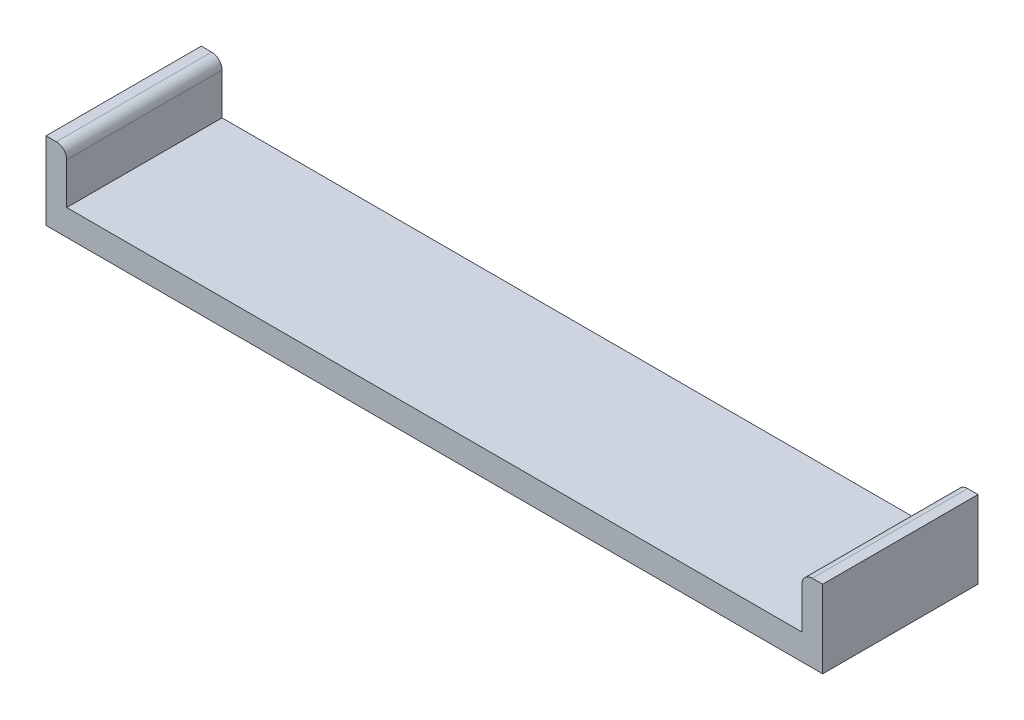
ISO-10303-21;
HEADER;
FILE_DESCRIPTION(('STEP AP214'),'2;1');
FILE_NAME('part.step','',(''),(''),'','','');
FILE_SCHEMA(('AUTOMOTIVE_DESIGN { 1 0 10303 214 1 1 1 1 }'));
ENDSEC;
DATA;
#1=APPLICATION_CONTEXT('core data for automotive mechanical design processes');
#2=APPLICATION_PROTOCOL_DEFINITION('international standard','automotive_design',2000,#1);
#3=PRODUCT_CONTEXT('',#1,'mechanical');
#4=PRODUCT('Part','Part','',(#3));
#5=PRODUCT_RELATED_PRODUCT_CATEGORY('part','',(#4));
#6=PRODUCT_DEFINITION_FORMATION('','',#4);
#7=PRODUCT_DEFINITION_CONTEXT('part definition',#1,'design');
#8=PRODUCT_DEFINITION('design','',#6,#7);
#9=PRODUCT_DEFINITION_SHAPE('','',#8);
#10=(LENGTH_UNIT() NAMED_UNIT(*) SI_UNIT(.MILLI.,.METRE.));
#11=(NAMED_UNIT(*) PLANE_ANGLE_UNIT() SI_UNIT($,.RADIAN.));
#12=(NAMED_UNIT(*) SI_UNIT($,.STERADIAN.) SOLID_ANGLE_UNIT());
#13=UNCERTAINTY_MEASURE_WITH_UNIT(LENGTH_MEASURE(1.E-05),#10,'distance_accuracy_value','');
#14=(GEOMETRIC_REPRESENTATION_CONTEXT(3) GLOBAL_UNCERTAINTY_ASSIGNED_CONTEXT((#13)) GLOBAL_UNIT_ASSIGNED_CONTEXT((#10,
#11,#12)) REPRESENTATION_CONTEXT('',''));
#15=CARTESIAN_POINT('',(0.,0.,0.));
#16=DIRECTION('',(0.,0.,1.));
#17=DIRECTION('',(1.,0.,0.));
#18=AXIS2_PLACEMENT_3D('',#15,#16,#17);
#19=CARTESIAN_POINT('',(0.,5.,0.));
#20=DIRECTION('',(0.,-1.,0.));
#21=DIRECTION('',(0.,0.,-1.));
#22=AXIS2_PLACEMENT_3D('',#19,#20,#21);
#23=PLANE('',#22);
#24=DIRECTION('',(0.,0.,-1.));
#25=VECTOR('',#24,1.);
#26=CARTESIAN_POINT('',(4.,5.,-30.));
#27=LINE('',#26,#25);
#28=CARTESIAN_POINT('',(4.,5.,0.));
#29=VERTEX_POINT('',#28);
#30=CARTESIAN_POINT('',(4.,5.,-30.));
#31=VERTEX_POINT('',#30);
#32=EDGE_CURVE('E138',#29,#31,#27,.T.);
#33=ORIENTED_EDGE('',*,*,#32,.F.);
#34=DIRECTION('',(1.,0.,0.));
#35=VECTOR('',#34,1.);
#36=CARTESIAN_POINT('',(0.,5.,0.));
#37=LINE('',#36,#35);
#38=CARTESIAN_POINT('',(146.,5.,0.));
#39=VERTEX_POINT('',#38);
#40=EDGE_CURVE('E163',#29,#39,#37,.T.);
#41=ORIENTED_EDGE('',*,*,#40,.T.);
#42=DIRECTION('',(0.,0.,1.));
#43=VECTOR('',#42,1.);
#44=CARTESIAN_POINT('',(146.,5.,-30.));
#45=LINE('',#44,#43);
#46=CARTESIAN_POINT('',(146.,5.,-30.));
#47=VERTEX_POINT('',#46);
#48=EDGE_CURVE('E148',#47,#39,#45,.T.);
#49=ORIENTED_EDGE('',*,*,#48,.F.);
#50=DIRECTION('',(-1.,0.,0.));
#51=VECTOR('',#50,1.);
#52=CARTESIAN_POINT('',(0.,5.,-30.));
#53=LINE('',#52,#51);
#54=EDGE_CURVE('E166',#47,#31,#53,.T.);
#55=ORIENTED_EDGE('',*,*,#54,.T.);
#56=EDGE_LOOP('',(#33,#41,#49,#55));
#57=FACE_BOUND('',#56,.T.);
#58=ADVANCED_FACE('F37',(#57),#23,.F.);
#59=CARTESIAN_POINT('',(0.,5.,0.));
#60=DIRECTION('',(1.,0.,0.));
#61=DIRECTION('',(0.,0.,-1.));
#62=AXIS2_PLACEMENT_3D('',#59,#60,#61);
#63=PLANE('',#62);
#64=DIRECTION('',(0.,0.,1.));
#65=VECTOR('',#64,1.);
#66=CARTESIAN_POINT('',(0.,0.,0.));
#67=LINE('',#66,#65);
#68=CARTESIAN_POINT('',(0.,0.,-30.));
#69=VERTEX_POINT('',#68);
#70=CARTESIAN_POINT('',(0.,0.,0.));
#71=VERTEX_POINT('',#70);
#72=EDGE_CURVE('E121',#69,#71,#67,.T.);
#73=ORIENTED_EDGE('',*,*,#72,.T.);
#74=DIRECTION('',(0.,-1.,0.));
#75=VECTOR('',#74,1.);
#76=CARTESIAN_POINT('',(0.,5.,0.));
#77=LINE('',#76,#75);
#78=CARTESIAN_POINT('',(0.,15.,0.));
#79=VERTEX_POINT('',#78);
#80=EDGE_CURVE('E114',#79,#71,#77,.T.);
#81=ORIENTED_EDGE('',*,*,#80,.F.);
#82=DIRECTION('',(0.,0.,1.));
#83=VECTOR('',#82,1.);
#84=CARTESIAN_POINT('',(0.,15.,-30.));
#85=LINE('',#84,#83);
#86=CARTESIAN_POINT('',(0.,15.,-30.));
#87=VERTEX_POINT('',#86);
#88=EDGE_CURVE('E119',#87,#79,#85,.T.);
#89=ORIENTED_EDGE('',*,*,#88,.F.);
#90=DIRECTION('',(0.,-1.,0.));
#91=VECTOR('',#90,1.);
#92=CARTESIAN_POINT('',(0.,5.,-30.));
#93=LINE('',#92,#91);
#94=EDGE_CURVE('E170',#87,#69,#93,.T.);
#95=ORIENTED_EDGE('',*,*,#94,.T.);
#96=EDGE_LOOP('',(#73,#81,#89,#95));
#97=FACE_BOUND('',#96,.T.);
#98=ADVANCED_FACE('F116',(#97),#63,.F.);
#99=CARTESIAN_POINT('',(0.,5.,0.));
#100=DIRECTION('',(0.,0.,-1.));
#101=DIRECTION('',(-1.,0.,0.));
#102=AXIS2_PLACEMENT_3D('',#99,#100,#101);
#103=PLANE('',#102);
#104=DIRECTION('',(1.,0.,0.));
#105=VECTOR('',#104,1.);
#106=CARTESIAN_POINT('',(150.,15.,0.));
#107=LINE('',#106,#105);
#108=CARTESIAN_POINT('',(148.,15.,0.));
#109=VERTEX_POINT('',#108);
#110=CARTESIAN_POINT('',(150.,15.,0.));
#111=VERTEX_POINT('',#110);
#112=EDGE_CURVE('E155',#109,#111,#107,.T.);
#113=ORIENTED_EDGE('',*,*,#112,.F.);
#114=CARTESIAN_POINT('',(148.,13.,0.));
#115=DIRECTION('',(0.,0.,-1.));
#116=DIRECTION('',(-1.,0.,0.));
#117=AXIS2_PLACEMENT_3D('',#114,#115,#116);
#118=CIRCLE('',#117,2.);
#119=CARTESIAN_POINT('',(146.,13.,0.));
#120=VERTEX_POINT('',#119);
#121=EDGE_CURVE('E186',#109,#120,#118,.F.);
#122=ORIENTED_EDGE('',*,*,#121,.T.);
#123=DIRECTION('',(0.,-1.,0.));
#124=VECTOR('',#123,1.);
#125=CARTESIAN_POINT('',(146.,15.,0.));
#126=LINE('',#125,#124);
#127=EDGE_CURVE('E157',#120,#39,#126,.T.);
#128=ORIENTED_EDGE('',*,*,#127,.T.);
#129=ORIENTED_EDGE('',*,*,#40,.F.);
#130=DIRECTION('',(0.,-1.,0.));
#131=VECTOR('',#130,1.);
#132=CARTESIAN_POINT('',(4.,15.,0.));
#133=LINE('',#132,#131);
#134=CARTESIAN_POINT('',(4.,13.,0.));
#135=VERTEX_POINT('',#134);
#136=EDGE_CURVE('E146',#135,#29,#133,.T.);
#137=ORIENTED_EDGE('',*,*,#136,.F.);
#138=CARTESIAN_POINT('',(2.,13.,0.));
#139=DIRECTION('',(0.,0.,-1.));
#140=DIRECTION('',(-1.,0.,0.));
#141=AXIS2_PLACEMENT_3D('',#138,#139,#140);
#142=CIRCLE('',#141,2.);
#143=CARTESIAN_POINT('',(2.,15.,0.));
#144=VERTEX_POINT('',#143);
#145=EDGE_CURVE('E132',#135,#144,#142,.F.);
#146=ORIENTED_EDGE('',*,*,#145,.T.);
#147=DIRECTION('',(1.,0.,0.));
#148=VECTOR('',#147,1.);
#149=CARTESIAN_POINT('',(0.,15.,0.));
#150=LINE('',#149,#148);
#151=EDGE_CURVE('E127',#79,#144,#150,.T.);
#152=ORIENTED_EDGE('',*,*,#151,.F.);
#153=ORIENTED_EDGE('',*,*,#80,.T.);
#154=DIRECTION('',(1.,0.,0.));
#155=VECTOR('',#154,1.);
#156=CARTESIAN_POINT('',(0.,0.,0.));
#157=LINE('',#156,#155);
#158=CARTESIAN_POINT('',(150.,0.,0.));
#159=VERTEX_POINT('',#158);
#160=EDGE_CURVE('E172',#71,#159,#157,.T.);
#161=ORIENTED_EDGE('',*,*,#160,.T.);
#162=DIRECTION('',(0.,-1.,0.));
#163=VECTOR('',#162,1.);
#164=CARTESIAN_POINT('',(150.,5.,0.));
#165=LINE('',#164,#163);
#166=EDGE_CURVE('E124',#111,#159,#165,.T.);
#167=ORIENTED_EDGE('',*,*,#166,.F.);
#168=EDGE_LOOP('',(#113,#122,#128,#129,#137,#146,#152,#153,#161,#167));
#169=FACE_BOUND('',#168,.T.);
#170=ADVANCED_FACE('F129',(#169),#103,.F.);
#171=CARTESIAN_POINT('',(150.,5.,0.));
#172=DIRECTION('',(-1.,0.,0.));
#173=DIRECTION('',(0.,0.,1.));
#174=AXIS2_PLACEMENT_3D('',#171,#172,#173);
#175=PLANE('',#174);
#176=DIRECTION('',(0.,0.,-1.));
#177=VECTOR('',#176,1.);
#178=CARTESIAN_POINT('',(150.,0.,0.));
#179=LINE('',#178,#177);
#180=CARTESIAN_POINT('',(150.,0.,-30.));
#181=VERTEX_POINT('',#180);
#182=EDGE_CURVE('E174',#159,#181,#179,.T.);
#183=ORIENTED_EDGE('',*,*,#182,.T.);
#184=DIRECTION('',(0.,-1.,0.));
#185=VECTOR('',#184,1.);
#186=CARTESIAN_POINT('',(150.,5.,-30.));
#187=LINE('',#186,#185);
#188=CARTESIAN_POINT('',(150.,15.,-30.));
#189=VERTEX_POINT('',#188);
#190=EDGE_CURVE('E178',#189,#181,#187,.T.);
#191=ORIENTED_EDGE('',*,*,#190,.F.);
#192=DIRECTION('',(0.,0.,-1.));
#193=VECTOR('',#192,1.);
#194=CARTESIAN_POINT('',(150.,15.,-30.));
#195=LINE('',#194,#193);
#196=EDGE_CURVE('E149',#111,#189,#195,.T.);
#197=ORIENTED_EDGE('',*,*,#196,.F.);
#198=ORIENTED_EDGE('',*,*,#166,.T.);
#199=EDGE_LOOP('',(#183,#191,#197,#198));
#200=FACE_BOUND('',#199,.T.);
#201=ADVANCED_FACE('F201',(#200),#175,.F.);
#202=CARTESIAN_POINT('',(0.,5.,-30.));
#203=DIRECTION('',(0.,0.,1.));
#204=DIRECTION('',(1.,0.,0.));
#205=AXIS2_PLACEMENT_3D('',#202,#203,#204);
#206=PLANE('',#205);
#207=DIRECTION('',(0.,-1.,0.));
#208=VECTOR('',#207,1.);
#209=CARTESIAN_POINT('',(146.,15.,-30.));
#210=LINE('',#209,#208);
#211=CARTESIAN_POINT('',(146.,13.,-30.));
#212=VERTEX_POINT('',#211);
#213=EDGE_CURVE('E161',#212,#47,#210,.T.);
#214=ORIENTED_EDGE('',*,*,#213,.F.);
#215=CARTESIAN_POINT('',(148.,13.,-30.));
#216=DIRECTION('',(0.,0.,1.));
#217=DIRECTION('',(1.,0.,0.));
#218=AXIS2_PLACEMENT_3D('',#215,#216,#217);
#219=CIRCLE('',#218,2.);
#220=CARTESIAN_POINT('',(148.,15.,-30.));
#221=VERTEX_POINT('',#220);
#222=EDGE_CURVE('E191',#212,#221,#219,.F.);
#223=ORIENTED_EDGE('',*,*,#222,.T.);
#224=DIRECTION('',(-1.,0.,0.));
#225=VECTOR('',#224,1.);
#226=CARTESIAN_POINT('',(150.,15.,-30.));
#227=LINE('',#226,#225);
#228=EDGE_CURVE('E152',#189,#221,#227,.T.);
#229=ORIENTED_EDGE('',*,*,#228,.F.);
#230=ORIENTED_EDGE('',*,*,#190,.T.);
#231=DIRECTION('',(-1.,0.,0.));
#232=VECTOR('',#231,1.);
#233=CARTESIAN_POINT('',(0.,0.,-30.));
#234=LINE('',#233,#232);
#235=EDGE_CURVE('E167',#181,#69,#234,.T.);
#236=ORIENTED_EDGE('',*,*,#235,.T.);
#237=ORIENTED_EDGE('',*,*,#94,.F.);
#238=DIRECTION('',(-1.,0.,0.));
#239=VECTOR('',#238,1.);
#240=CARTESIAN_POINT('',(0.,15.,-30.));
#241=LINE('',#240,#239);
#242=CARTESIAN_POINT('',(2.,15.,-30.));
#243=VERTEX_POINT('',#242);
#244=EDGE_CURVE('E134',#243,#87,#241,.T.);
#245=ORIENTED_EDGE('',*,*,#244,.F.);
#246=CARTESIAN_POINT('',(2.,13.,-30.));
#247=DIRECTION('',(0.,0.,1.));
#248=DIRECTION('',(1.,0.,0.));
#249=AXIS2_PLACEMENT_3D('',#246,#247,#248);
#250=CIRCLE('',#249,2.);
#251=CARTESIAN_POINT('',(4.,13.,-30.));
#252=VERTEX_POINT('',#251);
#253=EDGE_CURVE('E52',#243,#252,#250,.F.);
#254=ORIENTED_EDGE('',*,*,#253,.T.);
#255=DIRECTION('',(0.,-1.,0.));
#256=VECTOR('',#255,1.);
#257=CARTESIAN_POINT('',(4.,15.,-30.));
#258=LINE('',#257,#256);
#259=EDGE_CURVE('E143',#252,#31,#258,.T.);
#260=ORIENTED_EDGE('',*,*,#259,.T.);
#261=ORIENTED_EDGE('',*,*,#54,.F.);
#262=EDGE_LOOP('',(#214,#223,#229,#230,#236,#237,#245,#254,#260,#261));
#263=FACE_BOUND('',#262,.T.);
#264=ADVANCED_FACE('F193',(#263),#206,.F.);
#265=CARTESIAN_POINT('',(0.,0.,0.));
#266=DIRECTION('',(0.,-1.,0.));
#267=DIRECTION('',(0.,0.,-1.));
#268=AXIS2_PLACEMENT_3D('',#265,#266,#267);
#269=PLANE('',#268);
#270=ORIENTED_EDGE('',*,*,#72,.F.);
#271=ORIENTED_EDGE('',*,*,#235,.F.);
#272=ORIENTED_EDGE('',*,*,#182,.F.);
#273=ORIENTED_EDGE('',*,*,#160,.F.);
#274=EDGE_LOOP('',(#270,#271,#272,#273));
#275=FACE_BOUND('',#274,.T.);
#276=ADVANCED_FACE('F196',(#275),#269,.T.);
#277=CARTESIAN_POINT('',(146.,15.,-30.));
#278=DIRECTION('',(1.,0.,0.));
#279=DIRECTION('',(0.,0.,-1.));
#280=AXIS2_PLACEMENT_3D('',#277,#278,#279);
#281=PLANE('',#280);
#282=ORIENTED_EDGE('',*,*,#127,.F.);
#283=DIRECTION('',(0.,0.,1.));
#284=VECTOR('',#283,1.);
#285=CARTESIAN_POINT('',(146.,13.,-30.));
#286=LINE('',#285,#284);
#287=EDGE_CURVE('E188',#120,#212,#286,.F.);
#288=ORIENTED_EDGE('',*,*,#287,.T.);
#289=ORIENTED_EDGE('',*,*,#213,.T.);
#290=ORIENTED_EDGE('',*,*,#48,.T.);
#291=EDGE_LOOP('',(#282,#288,#289,#290));
#292=FACE_BOUND('',#291,.T.);
#293=ADVANCED_FACE('F211',(#292),#281,.F.);
#294=CARTESIAN_POINT('',(0.,15.,0.));
#295=DIRECTION('',(0.,-1.,0.));
#296=DIRECTION('',(0.,0.,-1.));
#297=AXIS2_PLACEMENT_3D('',#294,#295,#296);
#298=PLANE('',#297);
#299=ORIENTED_EDGE('',*,*,#228,.T.);
#300=DIRECTION('',(0.,0.,1.));
#301=VECTOR('',#300,1.);
#302=CARTESIAN_POINT('',(148.,15.,0.));
#303=LINE('',#302,#301);
#304=EDGE_CURVE('E123',#221,#109,#303,.T.);
#305=ORIENTED_EDGE('',*,*,#304,.T.);
#306=ORIENTED_EDGE('',*,*,#112,.T.);
#307=ORIENTED_EDGE('',*,*,#196,.T.);
#308=EDGE_LOOP('',(#299,#305,#306,#307));
#309=FACE_BOUND('',#308,.T.);
#310=ADVANCED_FACE('F204',(#309),#298,.F.);
#311=CARTESIAN_POINT('',(4.,15.,-30.));
#312=DIRECTION('',(-1.,0.,0.));
#313=DIRECTION('',(0.,0.,1.));
#314=AXIS2_PLACEMENT_3D('',#311,#312,#313);
#315=PLANE('',#314);
#316=ORIENTED_EDGE('',*,*,#259,.F.);
#317=DIRECTION('',(0.,0.,-1.));
#318=VECTOR('',#317,1.);
#319=CARTESIAN_POINT('',(4.,13.,0.));
#320=LINE('',#319,#318);
#321=EDGE_CURVE('E11',#252,#135,#320,.F.);
#322=ORIENTED_EDGE('',*,*,#321,.T.);
#323=ORIENTED_EDGE('',*,*,#136,.T.);
#324=ORIENTED_EDGE('',*,*,#32,.T.);
#325=EDGE_LOOP('',(#316,#322,#323,#324));
#326=FACE_BOUND('',#325,.T.);
#327=ADVANCED_FACE('F219',(#326),#315,.F.);
#328=CARTESIAN_POINT('',(0.,15.,0.));
#329=DIRECTION('',(0.,1.,0.));
#330=DIRECTION('',(0.,0.,1.));
#331=AXIS2_PLACEMENT_3D('',#328,#329,#330);
#332=PLANE('',#331);
#333=ORIENTED_EDGE('',*,*,#151,.T.);
#334=DIRECTION('',(0.,0.,-1.));
#335=VECTOR('',#334,1.);
#336=CARTESIAN_POINT('',(2.,15.,-30.));
#337=LINE('',#336,#335);
#338=EDGE_CURVE('E45',#144,#243,#337,.T.);
#339=ORIENTED_EDGE('',*,*,#338,.T.);
#340=ORIENTED_EDGE('',*,*,#244,.T.);
#341=ORIENTED_EDGE('',*,*,#88,.T.);
#342=EDGE_LOOP('',(#333,#339,#340,#341));
#343=FACE_BOUND('',#342,.T.);
#344=ADVANCED_FACE('F136',(#343),#332,.T.);
#345=CARTESIAN_POINT('',(148.,13.,0.));
#346=DIRECTION('',(0.,0.,1.));
#347=DIRECTION('',(1.,0.,0.));
#348=AXIS2_PLACEMENT_3D('',#345,#346,#347);
#349=CYLINDRICAL_SURFACE('',#348,2.);
#350=ORIENTED_EDGE('',*,*,#222,.F.);
#351=ORIENTED_EDGE('',*,*,#287,.F.);
#352=ORIENTED_EDGE('',*,*,#121,.F.);
#353=ORIENTED_EDGE('',*,*,#304,.F.);
#354=EDGE_LOOP('',(#350,#351,#352,#353));
#355=FACE_BOUND('',#354,.T.);
#356=ADVANCED_FACE('F214',(#355),#349,.T.);
#357=CARTESIAN_POINT('',(2.,13.,0.));
#358=DIRECTION('',(0.,0.,1.));
#359=DIRECTION('',(1.,0.,0.));
#360=AXIS2_PLACEMENT_3D('',#357,#358,#359);
#361=CYLINDRICAL_SURFACE('',#360,2.);
#362=ORIENTED_EDGE('',*,*,#145,.F.);
#363=ORIENTED_EDGE('',*,*,#321,.F.);
#364=ORIENTED_EDGE('',*,*,#253,.F.);
#365=ORIENTED_EDGE('',*,*,#338,.F.);
#366=EDGE_LOOP('',(#362,#363,#364,#365));
#367=FACE_BOUND('',#366,.T.);
#368=ADVANCED_FACE('F39',(#367),#361,.T.);
#369=CLOSED_SHELL('',(#58,#98,#170,#201,#264,#276,#293,#310,#327,#344,#356,#368));
#370=MANIFOLD_SOLID_BREP('B2',#369);
#371=ADVANCED_BREP_SHAPE_REPRESENTATION('',(#18,#370),#14);
#372=SHAPE_DEFINITION_REPRESENTATION(#9,#371);
ENDSEC;
END-ISO-10303-21;
